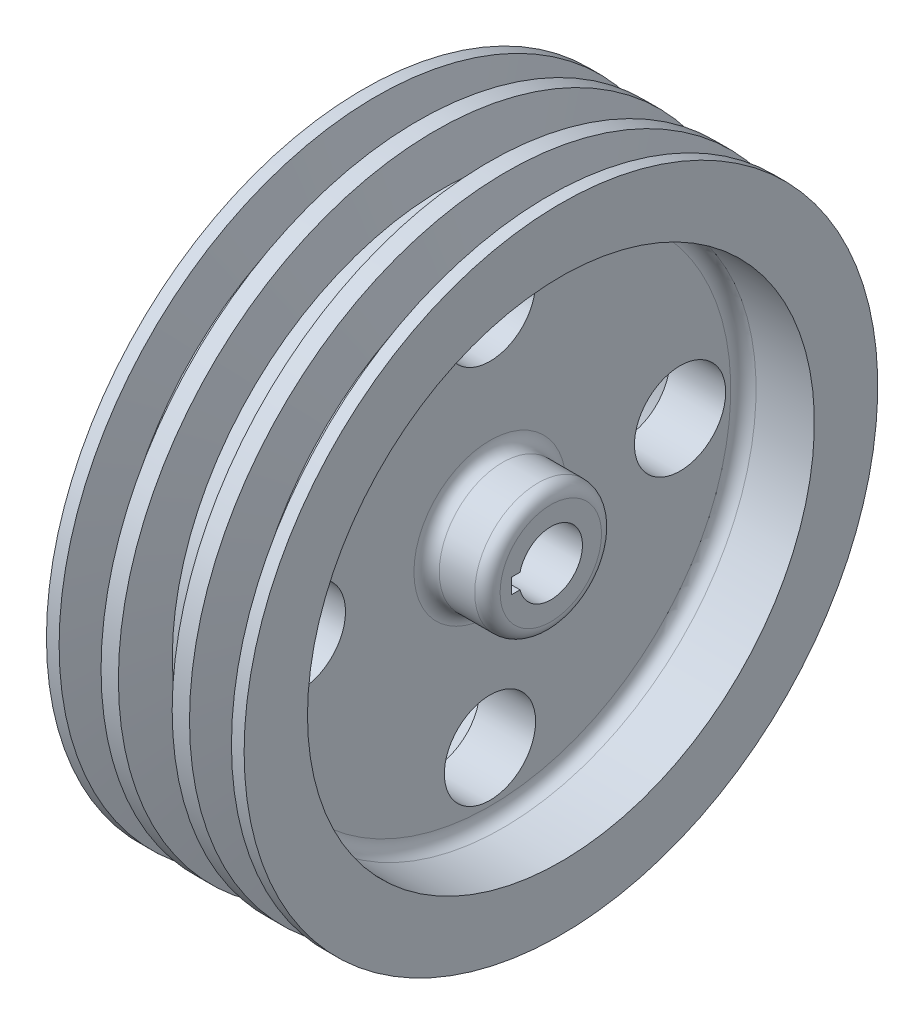
ISO-10303-21;
HEADER;
FILE_DESCRIPTION(('STEP AP214'),'2;1');
FILE_NAME('part.step','',(''),(''),'','','');
FILE_SCHEMA(('AUTOMOTIVE_DESIGN { 1 0 10303 214 1 1 1 1 }'));
ENDSEC;
DATA;
#1=APPLICATION_CONTEXT('core data for automotive mechanical design processes');
#2=APPLICATION_PROTOCOL_DEFINITION('international standard','automotive_design',2000,#1);
#3=PRODUCT_CONTEXT('',#1,'mechanical');
#4=PRODUCT('Part','Part','',(#3));
#5=PRODUCT_RELATED_PRODUCT_CATEGORY('part','',(#4));
#6=PRODUCT_DEFINITION_FORMATION('','',#4);
#7=PRODUCT_DEFINITION_CONTEXT('part definition',#1,'design');
#8=PRODUCT_DEFINITION('design','',#6,#7);
#9=PRODUCT_DEFINITION_SHAPE('','',#8);
#10=(LENGTH_UNIT() NAMED_UNIT(*) SI_UNIT(.MILLI.,.METRE.));
#11=(NAMED_UNIT(*) PLANE_ANGLE_UNIT() SI_UNIT($,.RADIAN.));
#12=(NAMED_UNIT(*) SI_UNIT($,.STERADIAN.) SOLID_ANGLE_UNIT());
#13=UNCERTAINTY_MEASURE_WITH_UNIT(LENGTH_MEASURE(1.E-05),#10,'distance_accuracy_value','');
#14=(GEOMETRIC_REPRESENTATION_CONTEXT(3) GLOBAL_UNCERTAINTY_ASSIGNED_CONTEXT((#13)) GLOBAL_UNIT_ASSIGNED_CONTEXT((#10,
#11,#12)) REPRESENTATION_CONTEXT('',''));
#15=CARTESIAN_POINT('',(0.,0.,0.));
#16=DIRECTION('',(0.,0.,1.));
#17=DIRECTION('',(1.,0.,0.));
#18=AXIS2_PLACEMENT_3D('',#15,#16,#17);
#19=CARTESIAN_POINT('',(-121.585294609812,0.,0.));
#20=DIRECTION('',(-1.,0.,0.));
#21=DIRECTION('',(0.,0.,1.));
#22=AXIS2_PLACEMENT_3D('',#19,#20,#21);
#23=CYLINDRICAL_SURFACE('',#22,25.);
#24=CARTESIAN_POINT('',(-30.,0.,0.));
#25=DIRECTION('',(-1.,0.,0.));
#26=DIRECTION('',(0.,0.,1.));
#27=AXIS2_PLACEMENT_3D('',#24,#25,#26);
#28=CIRCLE('',#27,25.);
#29=CARTESIAN_POINT('',(-30.,0.,25.));
#30=VERTEX_POINT('',#29);
#31=EDGE_CURVE('E195',#30,#30,#28,.T.);
#32=ORIENTED_EDGE('',*,*,#31,.F.);
#33=EDGE_LOOP('',(#32));
#34=FACE_BOUND('',#33,.T.);
#35=CARTESIAN_POINT('',(-16.,0.,0.));
#36=DIRECTION('',(-1.,0.,0.));
#37=DIRECTION('',(0.,0.,1.));
#38=AXIS2_PLACEMENT_3D('',#35,#36,#37);
#39=CIRCLE('',#38,25.);
#40=CARTESIAN_POINT('',(-16.,0.,25.));
#41=VERTEX_POINT('',#40);
#42=EDGE_CURVE('E102',#41,#41,#39,.T.);
#43=ORIENTED_EDGE('',*,*,#42,.T.);
#44=EDGE_LOOP('',(#43));
#45=FACE_BOUND('',#44,.T.);
#46=ADVANCED_FACE('F43',(#34,#45),#23,.T.);
#47=CARTESIAN_POINT('',(-30.,0.,0.));
#48=DIRECTION('',(-1.,0.,0.));
#49=DIRECTION('',(0.,0.,1.));
#50=AXIS2_PLACEMENT_3D('',#47,#48,#49);
#51=TOROIDAL_SURFACE('',#50,20.,5.);
#52=CARTESIAN_POINT('',(-35.,0.,0.));
#53=DIRECTION('',(-1.,0.,0.));
#54=DIRECTION('',(0.,0.,1.));
#55=AXIS2_PLACEMENT_3D('',#52,#53,#54);
#56=CIRCLE('',#55,20.);
#57=CARTESIAN_POINT('',(-35.,0.,20.));
#58=VERTEX_POINT('',#57);
#59=EDGE_CURVE('E188',#58,#58,#56,.T.);
#60=ORIENTED_EDGE('',*,*,#59,.F.);
#61=EDGE_LOOP('',(#60));
#62=FACE_BOUND('',#61,.T.);
#63=ORIENTED_EDGE('',*,*,#31,.T.);
#64=EDGE_LOOP('',(#63));
#65=FACE_BOUND('',#64,.T.);
#66=ADVANCED_FACE('F325',(#62,#65),#51,.T.);
#67=CARTESIAN_POINT('',(-35.,0.,0.));
#68=DIRECTION('',(1.,0.,0.));
#69=DIRECTION('',(0.,0.,-1.));
#70=AXIS2_PLACEMENT_3D('',#67,#68,#69);
#71=PLANE('',#70);
#72=DIRECTION('',(0.,-1.,0.));
#73=VECTOR('',#72,1.);
#74=CARTESIAN_POINT('',(-35.,0.,15.5));
#75=LINE('',#74,#73);
#76=CARTESIAN_POINT('',(-35.,3.,15.5));
#77=VERTEX_POINT('',#76);
#78=CARTESIAN_POINT('',(-35.,-3.,15.5));
#79=VERTEX_POINT('',#78);
#80=EDGE_CURVE('E83',#77,#79,#75,.T.);
#81=ORIENTED_EDGE('',*,*,#80,.T.);
#82=DIRECTION('',(0.,0.,-1.));
#83=VECTOR('',#82,1.);
#84=CARTESIAN_POINT('',(-35.,-3.,0.));
#85=LINE('',#84,#83);
#86=CARTESIAN_POINT('',(-35.,-3.,12.1346610995116));
#87=VERTEX_POINT('',#86);
#88=EDGE_CURVE('E105',#79,#87,#85,.T.);
#89=ORIENTED_EDGE('',*,*,#88,.T.);
#90=CARTESIAN_POINT('',(-35.,0.,0.));
#91=DIRECTION('',(-1.,0.,0.));
#92=DIRECTION('',(0.,0.,1.));
#93=AXIS2_PLACEMENT_3D('',#90,#91,#92);
#94=CIRCLE('',#93,12.5);
#95=CARTESIAN_POINT('',(-35.,3.,12.1346610995116));
#96=VERTEX_POINT('',#95);
#97=EDGE_CURVE('E101',#96,#87,#94,.T.);
#98=ORIENTED_EDGE('',*,*,#97,.F.);
#99=DIRECTION('',(0.,0.,1.));
#100=VECTOR('',#99,1.);
#101=CARTESIAN_POINT('',(-35.,3.,0.));
#102=LINE('',#101,#100);
#103=EDGE_CURVE('E87',#96,#77,#102,.T.);
#104=ORIENTED_EDGE('',*,*,#103,.T.);
#105=EDGE_LOOP('',(#81,#89,#98,#104));
#106=FACE_BOUND('',#105,.T.);
#107=ORIENTED_EDGE('',*,*,#59,.T.);
#108=EDGE_LOOP('',(#107));
#109=FACE_BOUND('',#108,.T.);
#110=ADVANCED_FACE('F98',(#106,#109),#71,.F.);
#111=CARTESIAN_POINT('',(-121.585294609812,0.,0.));
#112=DIRECTION('',(-1.,0.,0.));
#113=DIRECTION('',(0.,0.,1.));
#114=AXIS2_PLACEMENT_3D('',#111,#112,#113);
#115=CYLINDRICAL_SURFACE('',#114,12.5);
#116=DIRECTION('',(-1.,0.,0.));
#117=VECTOR('',#116,1.);
#118=CARTESIAN_POINT('',(39.,-3.,12.1346610995116));
#119=LINE('',#118,#117);
#120=CARTESIAN_POINT('',(35.,-3.,12.1346610995116));
#121=VERTEX_POINT('',#120);
#122=EDGE_CURVE('E63',#121,#87,#119,.T.);
#123=ORIENTED_EDGE('',*,*,#122,.F.);
#124=CARTESIAN_POINT('',(35.,0.,0.));
#125=DIRECTION('',(-1.,0.,0.));
#126=DIRECTION('',(0.,0.,1.));
#127=AXIS2_PLACEMENT_3D('',#124,#125,#126);
#128=CIRCLE('',#127,12.5);
#129=CARTESIAN_POINT('',(35.,3.,12.1346610995116));
#130=VERTEX_POINT('',#129);
#131=EDGE_CURVE('E183',#130,#121,#128,.T.);
#132=ORIENTED_EDGE('',*,*,#131,.F.);
#133=DIRECTION('',(-1.,0.,0.));
#134=VECTOR('',#133,1.);
#135=CARTESIAN_POINT('',(39.,3.,12.1346610995116));
#136=LINE('',#135,#134);
#137=EDGE_CURVE('E92',#130,#96,#136,.T.);
#138=ORIENTED_EDGE('',*,*,#137,.T.);
#139=ORIENTED_EDGE('',*,*,#97,.T.);
#140=EDGE_LOOP('',(#123,#132,#138,#139));
#141=FACE_BOUND('',#140,.T.);
#142=ADVANCED_FACE('F218',(#141),#115,.F.);
#143=CARTESIAN_POINT('',(35.,0.,0.));
#144=DIRECTION('',(1.,0.,0.));
#145=DIRECTION('',(0.,0.,-1.));
#146=AXIS2_PLACEMENT_3D('',#143,#144,#145);
#147=PLANE('',#146);
#148=DIRECTION('',(0.,0.,-1.));
#149=VECTOR('',#148,1.);
#150=CARTESIAN_POINT('',(35.,-3.,0.));
#151=LINE('',#150,#149);
#152=CARTESIAN_POINT('',(35.,-3.,15.5));
#153=VERTEX_POINT('',#152);
#154=EDGE_CURVE('E12',#153,#121,#151,.T.);
#155=ORIENTED_EDGE('',*,*,#154,.F.);
#156=DIRECTION('',(0.,-1.,0.));
#157=VECTOR('',#156,1.);
#158=CARTESIAN_POINT('',(35.,0.,15.5));
#159=LINE('',#158,#157);
#160=CARTESIAN_POINT('',(35.,3.,15.5));
#161=VERTEX_POINT('',#160);
#162=EDGE_CURVE('E194',#161,#153,#159,.T.);
#163=ORIENTED_EDGE('',*,*,#162,.F.);
#164=DIRECTION('',(0.,0.,1.));
#165=VECTOR('',#164,1.);
#166=CARTESIAN_POINT('',(35.,3.,0.));
#167=LINE('',#166,#165);
#168=EDGE_CURVE('E49',#130,#161,#167,.T.);
#169=ORIENTED_EDGE('',*,*,#168,.F.);
#170=ORIENTED_EDGE('',*,*,#131,.T.);
#171=EDGE_LOOP('',(#155,#163,#169,#170));
#172=FACE_BOUND('',#171,.T.);
#173=CARTESIAN_POINT('',(35.,0.,0.));
#174=DIRECTION('',(-1.,0.,0.));
#175=DIRECTION('',(0.,0.,1.));
#176=AXIS2_PLACEMENT_3D('',#173,#174,#175);
#177=CIRCLE('',#176,20.);
#178=CARTESIAN_POINT('',(35.,0.,20.));
#179=VERTEX_POINT('',#178);
#180=EDGE_CURVE('E185',#179,#179,#177,.T.);
#181=ORIENTED_EDGE('',*,*,#180,.F.);
#182=EDGE_LOOP('',(#181));
#183=FACE_BOUND('',#182,.T.);
#184=ADVANCED_FACE('F214',(#172,#183),#147,.T.);
#185=CARTESIAN_POINT('',(30.,0.,0.));
#186=DIRECTION('',(-1.,0.,0.));
#187=DIRECTION('',(0.,0.,1.));
#188=AXIS2_PLACEMENT_3D('',#185,#186,#187);
#189=TOROIDAL_SURFACE('',#188,20.,5.);
#190=CARTESIAN_POINT('',(30.,0.,0.));
#191=DIRECTION('',(-1.,0.,0.));
#192=DIRECTION('',(0.,0.,1.));
#193=AXIS2_PLACEMENT_3D('',#190,#191,#192);
#194=CIRCLE('',#193,25.);
#195=CARTESIAN_POINT('',(30.,0.,25.));
#196=VERTEX_POINT('',#195);
#197=EDGE_CURVE('E177',#196,#196,#194,.T.);
#198=ORIENTED_EDGE('',*,*,#197,.F.);
#199=EDGE_LOOP('',(#198));
#200=FACE_BOUND('',#199,.T.);
#201=ORIENTED_EDGE('',*,*,#180,.T.);
#202=EDGE_LOOP('',(#201));
#203=FACE_BOUND('',#202,.T.);
#204=ADVANCED_FACE('F520',(#200,#203),#189,.T.);
#205=CARTESIAN_POINT('',(-121.585294609812,0.,0.));
#206=DIRECTION('',(-1.,0.,0.));
#207=DIRECTION('',(0.,0.,1.));
#208=AXIS2_PLACEMENT_3D('',#205,#206,#207);
#209=CYLINDRICAL_SURFACE('',#208,25.);
#210=ORIENTED_EDGE('',*,*,#197,.T.);
#211=EDGE_LOOP('',(#210));
#212=FACE_BOUND('',#211,.T.);
#213=CARTESIAN_POINT('',(16.,0.,0.));
#214=DIRECTION('',(-1.,0.,0.));
#215=DIRECTION('',(0.,0.,1.));
#216=AXIS2_PLACEMENT_3D('',#213,#214,#215);
#217=CIRCLE('',#216,25.);
#218=CARTESIAN_POINT('',(16.,0.,25.));
#219=VERTEX_POINT('',#218);
#220=EDGE_CURVE('E178',#219,#219,#217,.T.);
#221=ORIENTED_EDGE('',*,*,#220,.F.);
#222=EDGE_LOOP('',(#221));
#223=FACE_BOUND('',#222,.T.);
#224=ADVANCED_FACE('F618',(#212,#223),#209,.T.);
#225=CARTESIAN_POINT('',(16.,0.,0.));
#226=DIRECTION('',(-1.,0.,0.));
#227=DIRECTION('',(0.,0.,1.));
#228=AXIS2_PLACEMENT_3D('',#225,#226,#227);
#229=TOROIDAL_SURFACE('',#228,30.,5.);
#230=CARTESIAN_POINT('',(11.,0.,0.));
#231=DIRECTION('',(-1.,0.,0.));
#232=DIRECTION('',(0.,0.,1.));
#233=AXIS2_PLACEMENT_3D('',#230,#231,#232);
#234=CIRCLE('',#233,30.);
#235=CARTESIAN_POINT('',(11.,0.,30.));
#236=VERTEX_POINT('',#235);
#237=EDGE_CURVE('E172',#236,#236,#234,.T.);
#238=ORIENTED_EDGE('',*,*,#237,.F.);
#239=EDGE_LOOP('',(#238));
#240=FACE_BOUND('',#239,.T.);
#241=ORIENTED_EDGE('',*,*,#220,.T.);
#242=EDGE_LOOP('',(#241));
#243=FACE_BOUND('',#242,.T.);
#244=ADVANCED_FACE('F236',(#240,#243),#229,.F.);
#245=CARTESIAN_POINT('',(11.,0.,0.));
#246=DIRECTION('',(1.,0.,0.));
#247=DIRECTION('',(0.,0.,-1.));
#248=AXIS2_PLACEMENT_3D('',#245,#246,#247);
#249=PLANE('',#248);
#250=CARTESIAN_POINT('',(11.,75.,0.));
#251=DIRECTION('',(1.,0.,0.));
#252=DIRECTION('',(0.,0.,-1.));
#253=AXIS2_PLACEMENT_3D('',#250,#251,#252);
#254=CIRCLE('',#253,18.);
#255=CARTESIAN_POINT('',(11.,75.,-18.));
#256=VERTEX_POINT('',#255);
#257=EDGE_CURVE('E86',#256,#256,#254,.T.);
#258=ORIENTED_EDGE('',*,*,#257,.F.);
#259=EDGE_LOOP('',(#258));
#260=FACE_BOUND('',#259,.T.);
#261=CARTESIAN_POINT('',(11.,7.85583301239705E-13,-75.));
#262=DIRECTION('',(1.,0.,0.));
#263=DIRECTION('',(0.,0.,-1.));
#264=AXIS2_PLACEMENT_3D('',#261,#262,#263);
#265=CIRCLE('',#264,18.);
#266=CARTESIAN_POINT('',(11.,7.85583301239705E-13,-93.));
#267=VERTEX_POINT('',#266);
#268=EDGE_CURVE('E210',#267,#267,#265,.T.);
#269=ORIENTED_EDGE('',*,*,#268,.F.);
#270=EDGE_LOOP('',(#269));
#271=FACE_BOUND('',#270,.T.);
#272=CARTESIAN_POINT('',(11.,-75.,-5.2372220082647E-13));
#273=DIRECTION('',(1.,0.,0.));
#274=DIRECTION('',(0.,0.,-1.));
#275=AXIS2_PLACEMENT_3D('',#272,#273,#274);
#276=CIRCLE('',#275,18.);
#277=CARTESIAN_POINT('',(11.,-75.,-18.0000000000005));
#278=VERTEX_POINT('',#277);
#279=EDGE_CURVE('E201',#278,#278,#276,.T.);
#280=ORIENTED_EDGE('',*,*,#279,.F.);
#281=EDGE_LOOP('',(#280));
#282=FACE_BOUND('',#281,.T.);
#283=CARTESIAN_POINT('',(11.,-2.61861100413235E-13,75.));
#284=DIRECTION('',(1.,0.,0.));
#285=DIRECTION('',(0.,0.,-1.));
#286=AXIS2_PLACEMENT_3D('',#283,#284,#285);
#287=CIRCLE('',#286,18.);
#288=CARTESIAN_POINT('',(11.,-2.61861100413235E-13,57.));
#289=VERTEX_POINT('',#288);
#290=EDGE_CURVE('E200',#289,#289,#287,.T.);
#291=ORIENTED_EDGE('',*,*,#290,.F.);
#292=EDGE_LOOP('',(#291));
#293=FACE_BOUND('',#292,.T.);
#294=ORIENTED_EDGE('',*,*,#237,.T.);
#295=EDGE_LOOP('',(#294));
#296=FACE_BOUND('',#295,.T.);
#297=CARTESIAN_POINT('',(11.,0.,0.));
#298=DIRECTION('',(-1.,0.,0.));
#299=DIRECTION('',(0.,0.,1.));
#300=AXIS2_PLACEMENT_3D('',#297,#298,#299);
#301=CIRCLE('',#300,95.);
#302=CARTESIAN_POINT('',(11.,0.,95.));
#303=VERTEX_POINT('',#302);
#304=EDGE_CURVE('E168',#303,#303,#301,.T.);
#305=ORIENTED_EDGE('',*,*,#304,.F.);
#306=EDGE_LOOP('',(#305));
#307=FACE_BOUND('',#306,.T.);
#308=ADVANCED_FACE('F232',(#260,#271,#282,#293,#296,#307),#249,.T.);
#309=CARTESIAN_POINT('',(16.,0.,0.));
#310=DIRECTION('',(-1.,0.,0.));
#311=DIRECTION('',(0.,0.,1.));
#312=AXIS2_PLACEMENT_3D('',#309,#310,#311);
#313=TOROIDAL_SURFACE('',#312,95.,5.);
#314=ORIENTED_EDGE('',*,*,#304,.T.);
#315=EDGE_LOOP('',(#314));
#316=FACE_BOUND('',#315,.T.);
#317=CARTESIAN_POINT('',(16.,0.,0.));
#318=DIRECTION('',(-1.,0.,0.));
#319=DIRECTION('',(0.,0.,1.));
#320=AXIS2_PLACEMENT_3D('',#317,#318,#319);
#321=CIRCLE('',#320,100.);
#322=CARTESIAN_POINT('',(16.,0.,100.));
#323=VERTEX_POINT('',#322);
#324=EDGE_CURVE('E170',#323,#323,#321,.T.);
#325=ORIENTED_EDGE('',*,*,#324,.F.);
#326=EDGE_LOOP('',(#325));
#327=FACE_BOUND('',#326,.T.);
#328=ADVANCED_FACE('F240',(#316,#327),#313,.F.);
#329=CARTESIAN_POINT('',(-121.585294609812,0.,0.));
#330=DIRECTION('',(-1.,0.,0.));
#331=DIRECTION('',(0.,0.,1.));
#332=AXIS2_PLACEMENT_3D('',#329,#330,#331);
#333=CYLINDRICAL_SURFACE('',#332,100.);
#334=ORIENTED_EDGE('',*,*,#324,.T.);
#335=EDGE_LOOP('',(#334));
#336=FACE_BOUND('',#335,.T.);
#337=CARTESIAN_POINT('',(39.,0.,0.));
#338=DIRECTION('',(-1.,0.,0.));
#339=DIRECTION('',(0.,0.,1.));
#340=AXIS2_PLACEMENT_3D('',#337,#338,#339);
#341=CIRCLE('',#340,100.);
#342=CARTESIAN_POINT('',(39.,0.,100.));
#343=VERTEX_POINT('',#342);
#344=EDGE_CURVE('E163',#343,#343,#341,.T.);
#345=ORIENTED_EDGE('',*,*,#344,.F.);
#346=EDGE_LOOP('',(#345));
#347=FACE_BOUND('',#346,.T.);
#348=ADVANCED_FACE('F252',(#336,#347),#333,.F.);
#349=CARTESIAN_POINT('',(39.,0.,0.));
#350=DIRECTION('',(1.,0.,0.));
#351=DIRECTION('',(0.,0.,-1.));
#352=AXIS2_PLACEMENT_3D('',#349,#350,#351);
#353=PLANE('',#352);
#354=ORIENTED_EDGE('',*,*,#344,.T.);
#355=EDGE_LOOP('',(#354));
#356=FACE_BOUND('',#355,.T.);
#357=CARTESIAN_POINT('',(39.,0.,0.));
#358=DIRECTION('',(-1.,0.,0.));
#359=DIRECTION('',(0.,0.,1.));
#360=AXIS2_PLACEMENT_3D('',#357,#358,#359);
#361=CIRCLE('',#360,125.);
#362=CARTESIAN_POINT('',(39.,0.,125.));
#363=VERTEX_POINT('',#362);
#364=EDGE_CURVE('E161',#363,#363,#361,.T.);
#365=ORIENTED_EDGE('',*,*,#364,.F.);
#366=EDGE_LOOP('',(#365));
#367=FACE_BOUND('',#366,.T.);
#368=ADVANCED_FACE('F256',(#356,#367),#353,.T.);
#369=CARTESIAN_POINT('',(-121.585294609812,0.,0.));
#370=DIRECTION('',(-1.,0.,0.));
#371=DIRECTION('',(0.,0.,1.));
#372=AXIS2_PLACEMENT_3D('',#369,#370,#371);
#373=CYLINDRICAL_SURFACE('',#372,125.);
#374=ORIENTED_EDGE('',*,*,#364,.T.);
#375=EDGE_LOOP('',(#374));
#376=FACE_BOUND('',#375,.T.);
#377=CARTESIAN_POINT('',(34.,0.,0.));
#378=DIRECTION('',(-1.,0.,0.));
#379=DIRECTION('',(0.,0.,1.));
#380=AXIS2_PLACEMENT_3D('',#377,#378,#379);
#381=CIRCLE('',#380,125.);
#382=CARTESIAN_POINT('',(34.,0.,125.));
#383=VERTEX_POINT('',#382);
#384=EDGE_CURVE('E158',#383,#383,#381,.T.);
#385=ORIENTED_EDGE('',*,*,#384,.F.);
#386=EDGE_LOOP('',(#385));
#387=FACE_BOUND('',#386,.T.);
#388=ADVANCED_FACE('F262',(#376,#387),#373,.T.);
#389=CARTESIAN_POINT('',(30.7242678916041,0.,0.));
#390=DIRECTION('',(1.,0.,0.));
#391=DIRECTION('',(0.,0.,-1.));
#392=AXIS2_PLACEMENT_3D('',#389,#390,#391);
#393=CONICAL_SURFACE('',#392,107.,1.39078123836655);
#394=ORIENTED_EDGE('',*,*,#384,.T.);
#395=EDGE_LOOP('',(#394));
#396=FACE_BOUND('',#395,.T.);
#397=CARTESIAN_POINT('',(30.7242678916041,0.,0.));
#398=DIRECTION('',(-1.,0.,0.));
#399=DIRECTION('',(0.,0.,1.));
#400=AXIS2_PLACEMENT_3D('',#397,#398,#399);
#401=CIRCLE('',#400,107.);
#402=CARTESIAN_POINT('',(30.7242678916041,0.,107.));
#403=VERTEX_POINT('',#402);
#404=EDGE_CURVE('E154',#403,#403,#401,.T.);
#405=ORIENTED_EDGE('',*,*,#404,.F.);
#406=EDGE_LOOP('',(#405));
#407=FACE_BOUND('',#406,.T.);
#408=ADVANCED_FACE('F269',(#396,#407),#393,.T.);
#409=CARTESIAN_POINT('',(-121.585294609812,0.,0.));
#410=DIRECTION('',(-1.,0.,0.));
#411=DIRECTION('',(0.,0.,1.));
#412=AXIS2_PLACEMENT_3D('',#409,#410,#411);
#413=CYLINDRICAL_SURFACE('',#412,107.);
#414=ORIENTED_EDGE('',*,*,#404,.T.);
#415=EDGE_LOOP('',(#414));
#416=FACE_BOUND('',#415,.T.);
#417=CARTESIAN_POINT('',(20.7242678916041,0.,0.));
#418=DIRECTION('',(-1.,0.,0.));
#419=DIRECTION('',(0.,0.,1.));
#420=AXIS2_PLACEMENT_3D('',#417,#418,#419);
#421=CIRCLE('',#420,107.);
#422=CARTESIAN_POINT('',(20.7242678916041,0.,107.));
#423=VERTEX_POINT('',#422);
#424=EDGE_CURVE('E155',#423,#423,#421,.T.);
#425=ORIENTED_EDGE('',*,*,#424,.F.);
#426=EDGE_LOOP('',(#425));
#427=FACE_BOUND('',#426,.T.);
#428=ADVANCED_FACE('F277',(#416,#427),#413,.T.);
#429=CARTESIAN_POINT('',(17.4485357832083,0.,0.));
#430=DIRECTION('',(-1.,0.,0.));
#431=DIRECTION('',(0.,0.,1.));
#432=AXIS2_PLACEMENT_3D('',#429,#430,#431);
#433=CONICAL_SURFACE('',#432,125.,1.39078123836656);
#434=ORIENTED_EDGE('',*,*,#424,.T.);
#435=EDGE_LOOP('',(#434));
#436=FACE_BOUND('',#435,.T.);
#437=CARTESIAN_POINT('',(17.4485357832083,0.,0.));
#438=DIRECTION('',(-1.,0.,0.));
#439=DIRECTION('',(0.,0.,1.));
#440=AXIS2_PLACEMENT_3D('',#437,#438,#439);
#441=CIRCLE('',#440,125.);
#442=CARTESIAN_POINT('',(17.4485357832083,0.,125.));
#443=VERTEX_POINT('',#442);
#444=EDGE_CURVE('E149',#443,#443,#441,.T.);
#445=ORIENTED_EDGE('',*,*,#444,.F.);
#446=EDGE_LOOP('',(#445));
#447=FACE_BOUND('',#446,.T.);
#448=ADVANCED_FACE('F285',(#436,#447),#433,.T.);
#449=CARTESIAN_POINT('',(-121.585294609812,0.,0.));
#450=DIRECTION('',(-1.,0.,0.));
#451=DIRECTION('',(0.,0.,1.));
#452=AXIS2_PLACEMENT_3D('',#449,#450,#451);
#453=CYLINDRICAL_SURFACE('',#452,125.);
#454=ORIENTED_EDGE('',*,*,#444,.T.);
#455=EDGE_LOOP('',(#454));
#456=FACE_BOUND('',#455,.T.);
#457=CARTESIAN_POINT('',(10.6113648581892,0.,0.));
#458=DIRECTION('',(-1.,0.,0.));
#459=DIRECTION('',(0.,0.,1.));
#460=AXIS2_PLACEMENT_3D('',#457,#458,#459);
#461=CIRCLE('',#460,125.);
#462=CARTESIAN_POINT('',(10.6113648581892,0.,125.));
#463=VERTEX_POINT('',#462);
#464=EDGE_CURVE('E148',#463,#463,#461,.T.);
#465=ORIENTED_EDGE('',*,*,#464,.F.);
#466=EDGE_LOOP('',(#465));
#467=FACE_BOUND('',#466,.T.);
#468=ADVANCED_FACE('F286',(#456,#467),#453,.T.);
#469=CARTESIAN_POINT('',(7.33563274979332,0.,0.));
#470=DIRECTION('',(1.,0.,0.));
#471=DIRECTION('',(0.,0.,-1.));
#472=AXIS2_PLACEMENT_3D('',#469,#470,#471);
#473=CONICAL_SURFACE('',#472,107.,1.39078123836655);
#474=ORIENTED_EDGE('',*,*,#464,.T.);
#475=EDGE_LOOP('',(#474));
#476=FACE_BOUND('',#475,.T.);
#477=CARTESIAN_POINT('',(7.33563274979332,0.,0.));
#478=DIRECTION('',(-1.,0.,0.));
#479=DIRECTION('',(0.,0.,1.));
#480=AXIS2_PLACEMENT_3D('',#477,#478,#479);
#481=CIRCLE('',#480,107.);
#482=CARTESIAN_POINT('',(7.33563274979332,0.,107.));
#483=VERTEX_POINT('',#482);
#484=EDGE_CURVE('E141',#483,#483,#481,.T.);
#485=ORIENTED_EDGE('',*,*,#484,.F.);
#486=EDGE_LOOP('',(#485));
#487=FACE_BOUND('',#486,.T.);
#488=ADVANCED_FACE('F294',(#476,#487),#473,.T.);
#489=CARTESIAN_POINT('',(-121.585294609812,0.,0.));
#490=DIRECTION('',(-1.,0.,0.));
#491=DIRECTION('',(0.,0.,1.));
#492=AXIS2_PLACEMENT_3D('',#489,#490,#491);
#493=CYLINDRICAL_SURFACE('',#492,107.);
#494=ORIENTED_EDGE('',*,*,#484,.T.);
#495=EDGE_LOOP('',(#494));
#496=FACE_BOUND('',#495,.T.);
#497=CARTESIAN_POINT('',(-7.33563274979339,0.,0.));
#498=DIRECTION('',(-1.,0.,0.));
#499=DIRECTION('',(0.,0.,1.));
#500=AXIS2_PLACEMENT_3D('',#497,#498,#499);
#501=CIRCLE('',#500,107.);
#502=CARTESIAN_POINT('',(-7.33563274979339,0.,107.));
#503=VERTEX_POINT('',#502);
#504=EDGE_CURVE('E139',#503,#503,#501,.T.);
#505=ORIENTED_EDGE('',*,*,#504,.F.);
#506=EDGE_LOOP('',(#505));
#507=FACE_BOUND('',#506,.T.);
#508=ADVANCED_FACE('F299',(#496,#507),#493,.T.);
#509=CARTESIAN_POINT('',(-7.33563274979339,0.,0.));
#510=DIRECTION('',(-1.,0.,0.));
#511=DIRECTION('',(0.,0.,1.));
#512=AXIS2_PLACEMENT_3D('',#509,#510,#511);
#513=CONICAL_SURFACE('',#512,107.,1.39078123836656);
#514=CARTESIAN_POINT('',(-10.6113648581892,0.,0.));
#515=DIRECTION('',(-1.,0.,0.));
#516=DIRECTION('',(0.,0.,1.));
#517=AXIS2_PLACEMENT_3D('',#514,#515,#516);
#518=CIRCLE('',#517,125.);
#519=CARTESIAN_POINT('',(-10.6113648581892,0.,125.));
#520=VERTEX_POINT('',#519);
#521=EDGE_CURVE('E140',#520,#520,#518,.T.);
#522=ORIENTED_EDGE('',*,*,#521,.F.);
#523=EDGE_LOOP('',(#522));
#524=FACE_BOUND('',#523,.T.);
#525=ORIENTED_EDGE('',*,*,#504,.T.);
#526=EDGE_LOOP('',(#525));
#527=FACE_BOUND('',#526,.T.);
#528=ADVANCED_FACE('F308',(#524,#527),#513,.T.);
#529=CARTESIAN_POINT('',(-121.585294609812,0.,0.));
#530=DIRECTION('',(-1.,0.,0.));
#531=DIRECTION('',(0.,0.,1.));
#532=AXIS2_PLACEMENT_3D('',#529,#530,#531);
#533=CYLINDRICAL_SURFACE('',#532,125.);
#534=CARTESIAN_POINT('',(-17.4485357832083,0.,0.));
#535=DIRECTION('',(-1.,0.,0.));
#536=DIRECTION('',(0.,0.,1.));
#537=AXIS2_PLACEMENT_3D('',#534,#535,#536);
#538=CIRCLE('',#537,125.);
#539=CARTESIAN_POINT('',(-17.4485357832083,0.,125.));
#540=VERTEX_POINT('',#539);
#541=EDGE_CURVE('E133',#540,#540,#538,.T.);
#542=ORIENTED_EDGE('',*,*,#541,.F.);
#543=EDGE_LOOP('',(#542));
#544=FACE_BOUND('',#543,.T.);
#545=ORIENTED_EDGE('',*,*,#521,.T.);
#546=EDGE_LOOP('',(#545));
#547=FACE_BOUND('',#546,.T.);
#548=ADVANCED_FACE('F313',(#544,#547),#533,.T.);
#549=CARTESIAN_POINT('',(-17.4485357832083,0.,0.));
#550=DIRECTION('',(1.,0.,0.));
#551=DIRECTION('',(0.,0.,-1.));
#552=AXIS2_PLACEMENT_3D('',#549,#550,#551);
#553=CONICAL_SURFACE('',#552,125.,1.39078123836656);
#554=CARTESIAN_POINT('',(-20.7242678916041,0.,0.));
#555=DIRECTION('',(-1.,0.,0.));
#556=DIRECTION('',(0.,0.,1.));
#557=AXIS2_PLACEMENT_3D('',#554,#555,#556);
#558=CIRCLE('',#557,107.);
#559=CARTESIAN_POINT('',(-20.7242678916041,0.,107.));
#560=VERTEX_POINT('',#559);
#561=EDGE_CURVE('E131',#560,#560,#558,.T.);
#562=ORIENTED_EDGE('',*,*,#561,.F.);
#563=EDGE_LOOP('',(#562));
#564=FACE_BOUND('',#563,.T.);
#565=ORIENTED_EDGE('',*,*,#541,.T.);
#566=EDGE_LOOP('',(#565));
#567=FACE_BOUND('',#566,.T.);
#568=ADVANCED_FACE('F320',(#564,#567),#553,.T.);
#569=CARTESIAN_POINT('',(-121.585294609812,0.,0.));
#570=DIRECTION('',(-1.,0.,0.));
#571=DIRECTION('',(0.,0.,1.));
#572=AXIS2_PLACEMENT_3D('',#569,#570,#571);
#573=CYLINDRICAL_SURFACE('',#572,107.);
#574=CARTESIAN_POINT('',(-30.7242678916041,0.,0.));
#575=DIRECTION('',(-1.,0.,0.));
#576=DIRECTION('',(0.,0.,1.));
#577=AXIS2_PLACEMENT_3D('',#574,#575,#576);
#578=CIRCLE('',#577,107.);
#579=CARTESIAN_POINT('',(-30.7242678916041,0.,107.));
#580=VERTEX_POINT('',#579);
#581=EDGE_CURVE('E126',#580,#580,#578,.T.);
#582=ORIENTED_EDGE('',*,*,#581,.F.);
#583=EDGE_LOOP('',(#582));
#584=FACE_BOUND('',#583,.T.);
#585=ORIENTED_EDGE('',*,*,#561,.T.);
#586=EDGE_LOOP('',(#585));
#587=FACE_BOUND('',#586,.T.);
#588=ADVANCED_FACE('F366',(#584,#587),#573,.T.);
#589=CARTESIAN_POINT('',(-30.7242678916041,0.,0.));
#590=DIRECTION('',(-1.,0.,0.));
#591=DIRECTION('',(0.,0.,1.));
#592=AXIS2_PLACEMENT_3D('',#589,#590,#591);
#593=CONICAL_SURFACE('',#592,107.,1.39078123836655);
#594=CARTESIAN_POINT('',(-34.,0.,0.));
#595=DIRECTION('',(-1.,0.,0.));
#596=DIRECTION('',(0.,0.,1.));
#597=AXIS2_PLACEMENT_3D('',#594,#595,#596);
#598=CIRCLE('',#597,125.);
#599=CARTESIAN_POINT('',(-34.,0.,125.));
#600=VERTEX_POINT('',#599);
#601=EDGE_CURVE('E124',#600,#600,#598,.T.);
#602=ORIENTED_EDGE('',*,*,#601,.F.);
#603=EDGE_LOOP('',(#602));
#604=FACE_BOUND('',#603,.T.);
#605=ORIENTED_EDGE('',*,*,#581,.T.);
#606=EDGE_LOOP('',(#605));
#607=FACE_BOUND('',#606,.T.);
#608=ADVANCED_FACE('F365',(#604,#607),#593,.T.);
#609=CARTESIAN_POINT('',(-121.585294609812,0.,0.));
#610=DIRECTION('',(-1.,0.,0.));
#611=DIRECTION('',(0.,0.,1.));
#612=AXIS2_PLACEMENT_3D('',#609,#610,#611);
#613=CYLINDRICAL_SURFACE('',#612,125.);
#614=CARTESIAN_POINT('',(-39.,0.,0.));
#615=DIRECTION('',(-1.,0.,0.));
#616=DIRECTION('',(0.,0.,1.));
#617=AXIS2_PLACEMENT_3D('',#614,#615,#616);
#618=CIRCLE('',#617,125.);
#619=CARTESIAN_POINT('',(-39.,0.,125.));
#620=VERTEX_POINT('',#619);
#621=EDGE_CURVE('E125',#620,#620,#618,.T.);
#622=ORIENTED_EDGE('',*,*,#621,.F.);
#623=EDGE_LOOP('',(#622));
#624=FACE_BOUND('',#623,.T.);
#625=ORIENTED_EDGE('',*,*,#601,.T.);
#626=EDGE_LOOP('',(#625));
#627=FACE_BOUND('',#626,.T.);
#628=ADVANCED_FACE('F359',(#624,#627),#613,.T.);
#629=CARTESIAN_POINT('',(-39.,0.,0.));
#630=DIRECTION('',(1.,0.,0.));
#631=DIRECTION('',(0.,0.,-1.));
#632=AXIS2_PLACEMENT_3D('',#629,#630,#631);
#633=PLANE('',#632);
#634=CARTESIAN_POINT('',(-39.,0.,0.));
#635=DIRECTION('',(-1.,0.,0.));
#636=DIRECTION('',(0.,0.,1.));
#637=AXIS2_PLACEMENT_3D('',#634,#635,#636);
#638=CIRCLE('',#637,100.);
#639=CARTESIAN_POINT('',(-39.,0.,100.));
#640=VERTEX_POINT('',#639);
#641=EDGE_CURVE('E118',#640,#640,#638,.T.);
#642=ORIENTED_EDGE('',*,*,#641,.F.);
#643=EDGE_LOOP('',(#642));
#644=FACE_BOUND('',#643,.T.);
#645=ORIENTED_EDGE('',*,*,#621,.T.);
#646=EDGE_LOOP('',(#645));
#647=FACE_BOUND('',#646,.T.);
#648=ADVANCED_FACE('F353',(#644,#647),#633,.F.);
#649=CARTESIAN_POINT('',(-121.585294609812,0.,0.));
#650=DIRECTION('',(-1.,0.,0.));
#651=DIRECTION('',(0.,0.,1.));
#652=AXIS2_PLACEMENT_3D('',#649,#650,#651);
#653=CYLINDRICAL_SURFACE('',#652,100.);
#654=CARTESIAN_POINT('',(-16.,0.,0.));
#655=DIRECTION('',(-1.,0.,0.));
#656=DIRECTION('',(0.,0.,1.));
#657=AXIS2_PLACEMENT_3D('',#654,#655,#656);
#658=CIRCLE('',#657,100.);
#659=CARTESIAN_POINT('',(-16.,0.,100.));
#660=VERTEX_POINT('',#659);
#661=EDGE_CURVE('E116',#660,#660,#658,.T.);
#662=ORIENTED_EDGE('',*,*,#661,.F.);
#663=EDGE_LOOP('',(#662));
#664=FACE_BOUND('',#663,.T.);
#665=ORIENTED_EDGE('',*,*,#641,.T.);
#666=EDGE_LOOP('',(#665));
#667=FACE_BOUND('',#666,.T.);
#668=ADVANCED_FACE('F346',(#664,#667),#653,.F.);
#669=CARTESIAN_POINT('',(-16.,0.,0.));
#670=DIRECTION('',(-1.,0.,0.));
#671=DIRECTION('',(0.,0.,1.));
#672=AXIS2_PLACEMENT_3D('',#669,#670,#671);
#673=TOROIDAL_SURFACE('',#672,95.,5.);
#674=ORIENTED_EDGE('',*,*,#661,.T.);
#675=EDGE_LOOP('',(#674));
#676=FACE_BOUND('',#675,.T.);
#677=CARTESIAN_POINT('',(-11.,0.,0.));
#678=DIRECTION('',(-1.,0.,0.));
#679=DIRECTION('',(0.,0.,1.));
#680=AXIS2_PLACEMENT_3D('',#677,#678,#679);
#681=CIRCLE('',#680,95.);
#682=CARTESIAN_POINT('',(-11.,0.,95.));
#683=VERTEX_POINT('',#682);
#684=EDGE_CURVE('E114',#683,#683,#681,.T.);
#685=ORIENTED_EDGE('',*,*,#684,.F.);
#686=EDGE_LOOP('',(#685));
#687=FACE_BOUND('',#686,.T.);
#688=ADVANCED_FACE('F345',(#676,#687),#673,.F.);
#689=CARTESIAN_POINT('',(-11.,0.,0.));
#690=DIRECTION('',(1.,0.,0.));
#691=DIRECTION('',(0.,0.,-1.));
#692=AXIS2_PLACEMENT_3D('',#689,#690,#691);
#693=PLANE('',#692);
#694=CARTESIAN_POINT('',(-11.,75.,0.));
#695=DIRECTION('',(1.,0.,0.));
#696=DIRECTION('',(0.,0.,-1.));
#697=AXIS2_PLACEMENT_3D('',#694,#695,#696);
#698=CIRCLE('',#697,18.);
#699=CARTESIAN_POINT('',(-11.,75.,-18.));
#700=VERTEX_POINT('',#699);
#701=EDGE_CURVE('E208',#700,#700,#698,.T.);
#702=ORIENTED_EDGE('',*,*,#701,.T.);
#703=EDGE_LOOP('',(#702));
#704=FACE_BOUND('',#703,.T.);
#705=CARTESIAN_POINT('',(-11.,7.85583301239705E-13,-75.));
#706=DIRECTION('',(1.,0.,0.));
#707=DIRECTION('',(0.,0.,-1.));
#708=AXIS2_PLACEMENT_3D('',#705,#706,#707);
#709=CIRCLE('',#708,18.);
#710=CARTESIAN_POINT('',(-11.,7.85583301239705E-13,-93.));
#711=VERTEX_POINT('',#710);
#712=EDGE_CURVE('E204',#711,#711,#709,.T.);
#713=ORIENTED_EDGE('',*,*,#712,.T.);
#714=EDGE_LOOP('',(#713));
#715=FACE_BOUND('',#714,.T.);
#716=CARTESIAN_POINT('',(-11.,-75.,-5.2372220082647E-13));
#717=DIRECTION('',(1.,0.,0.));
#718=DIRECTION('',(0.,0.,-1.));
#719=AXIS2_PLACEMENT_3D('',#716,#717,#718);
#720=CIRCLE('',#719,18.);
#721=CARTESIAN_POINT('',(-11.,-75.,-18.0000000000005));
#722=VERTEX_POINT('',#721);
#723=EDGE_CURVE('E199',#722,#722,#720,.T.);
#724=ORIENTED_EDGE('',*,*,#723,.T.);
#725=EDGE_LOOP('',(#724));
#726=FACE_BOUND('',#725,.T.);
#727=CARTESIAN_POINT('',(-11.,-2.61861100413235E-13,75.));
#728=DIRECTION('',(1.,0.,0.));
#729=DIRECTION('',(0.,0.,-1.));
#730=AXIS2_PLACEMENT_3D('',#727,#728,#729);
#731=CIRCLE('',#730,18.);
#732=CARTESIAN_POINT('',(-11.,-2.61861100413235E-13,57.));
#733=VERTEX_POINT('',#732);
#734=EDGE_CURVE('E198',#733,#733,#731,.T.);
#735=ORIENTED_EDGE('',*,*,#734,.T.);
#736=EDGE_LOOP('',(#735));
#737=FACE_BOUND('',#736,.T.);
#738=CARTESIAN_POINT('',(-11.,0.,0.));
#739=DIRECTION('',(-1.,0.,0.));
#740=DIRECTION('',(0.,0.,1.));
#741=AXIS2_PLACEMENT_3D('',#738,#739,#740);
#742=CIRCLE('',#741,30.);
#743=CARTESIAN_POINT('',(-11.,0.,30.));
#744=VERTEX_POINT('',#743);
#745=EDGE_CURVE('E109',#744,#744,#742,.T.);
#746=ORIENTED_EDGE('',*,*,#745,.F.);
#747=EDGE_LOOP('',(#746));
#748=FACE_BOUND('',#747,.T.);
#749=ORIENTED_EDGE('',*,*,#684,.T.);
#750=EDGE_LOOP('',(#749));
#751=FACE_BOUND('',#750,.T.);
#752=ADVANCED_FACE('F336',(#704,#715,#726,#737,#748,#751),#693,.F.);
#753=CARTESIAN_POINT('',(-16.,0.,0.));
#754=DIRECTION('',(-1.,0.,0.));
#755=DIRECTION('',(0.,0.,1.));
#756=AXIS2_PLACEMENT_3D('',#753,#754,#755);
#757=TOROIDAL_SURFACE('',#756,30.,5.);
#758=ORIENTED_EDGE('',*,*,#42,.F.);
#759=EDGE_LOOP('',(#758));
#760=FACE_BOUND('',#759,.T.);
#761=ORIENTED_EDGE('',*,*,#745,.T.);
#762=EDGE_LOOP('',(#761));
#763=FACE_BOUND('',#762,.T.);
#764=ADVANCED_FACE('F335',(#760,#763),#757,.F.);
#765=CARTESIAN_POINT('',(39.,-2.61861100413235E-13,75.));
#766=DIRECTION('',(-1.,0.,0.));
#767=DIRECTION('',(0.,0.,1.));
#768=AXIS2_PLACEMENT_3D('',#765,#766,#767);
#769=CYLINDRICAL_SURFACE('',#768,18.);
#770=ORIENTED_EDGE('',*,*,#290,.T.);
#771=EDGE_LOOP('',(#770));
#772=FACE_BOUND('',#771,.T.);
#773=ORIENTED_EDGE('',*,*,#734,.F.);
#774=EDGE_LOOP('',(#773));
#775=FACE_BOUND('',#774,.T.);
#776=ADVANCED_FACE('F333',(#772,#775),#769,.F.);
#777=CARTESIAN_POINT('',(39.,-75.,-5.2372220082647E-13));
#778=DIRECTION('',(-1.,0.,0.));
#779=DIRECTION('',(0.,0.,1.));
#780=AXIS2_PLACEMENT_3D('',#777,#778,#779);
#781=CYLINDRICAL_SURFACE('',#780,18.);
#782=ORIENTED_EDGE('',*,*,#279,.T.);
#783=EDGE_LOOP('',(#782));
#784=FACE_BOUND('',#783,.T.);
#785=ORIENTED_EDGE('',*,*,#723,.F.);
#786=EDGE_LOOP('',(#785));
#787=FACE_BOUND('',#786,.T.);
#788=ADVANCED_FACE('F436',(#784,#787),#781,.F.);
#789=CARTESIAN_POINT('',(39.,7.85583301239705E-13,-75.));
#790=DIRECTION('',(-1.,0.,0.));
#791=DIRECTION('',(0.,0.,1.));
#792=AXIS2_PLACEMENT_3D('',#789,#790,#791);
#793=CYLINDRICAL_SURFACE('',#792,18.);
#794=ORIENTED_EDGE('',*,*,#268,.T.);
#795=EDGE_LOOP('',(#794));
#796=FACE_BOUND('',#795,.T.);
#797=ORIENTED_EDGE('',*,*,#712,.F.);
#798=EDGE_LOOP('',(#797));
#799=FACE_BOUND('',#798,.T.);
#800=ADVANCED_FACE('F446',(#796,#799),#793,.F.);
#801=CARTESIAN_POINT('',(39.,75.,0.));
#802=DIRECTION('',(-1.,0.,0.));
#803=DIRECTION('',(0.,0.,1.));
#804=AXIS2_PLACEMENT_3D('',#801,#802,#803);
#805=CYLINDRICAL_SURFACE('',#804,18.);
#806=ORIENTED_EDGE('',*,*,#257,.T.);
#807=EDGE_LOOP('',(#806));
#808=FACE_BOUND('',#807,.T.);
#809=ORIENTED_EDGE('',*,*,#701,.F.);
#810=EDGE_LOOP('',(#809));
#811=FACE_BOUND('',#810,.T.);
#812=ADVANCED_FACE('F233',(#808,#811),#805,.F.);
#813=CARTESIAN_POINT('',(39.,-3.,15.5));
#814=DIRECTION('',(0.,-1.,0.));
#815=DIRECTION('',(0.,0.,-1.));
#816=AXIS2_PLACEMENT_3D('',#813,#814,#815);
#817=PLANE('',#816);
#818=DIRECTION('',(-1.,0.,0.));
#819=VECTOR('',#818,1.);
#820=CARTESIAN_POINT('',(39.,-3.,15.5));
#821=LINE('',#820,#819);
#822=EDGE_CURVE('E82',#153,#79,#821,.T.);
#823=ORIENTED_EDGE('',*,*,#822,.F.);
#824=ORIENTED_EDGE('',*,*,#154,.T.);
#825=ORIENTED_EDGE('',*,*,#122,.T.);
#826=ORIENTED_EDGE('',*,*,#88,.F.);
#827=EDGE_LOOP('',(#823,#824,#825,#826));
#828=FACE_BOUND('',#827,.T.);
#829=ADVANCED_FACE('F213',(#828),#817,.F.);
#830=CARTESIAN_POINT('',(39.,3.,15.5));
#831=DIRECTION('',(0.,1.,0.));
#832=DIRECTION('',(0.,0.,1.));
#833=AXIS2_PLACEMENT_3D('',#830,#831,#832);
#834=PLANE('',#833);
#835=ORIENTED_EDGE('',*,*,#137,.F.);
#836=ORIENTED_EDGE('',*,*,#168,.T.);
#837=DIRECTION('',(-1.,0.,0.));
#838=VECTOR('',#837,1.);
#839=CARTESIAN_POINT('',(39.,3.,15.5));
#840=LINE('',#839,#838);
#841=EDGE_CURVE('E60',#161,#77,#840,.T.);
#842=ORIENTED_EDGE('',*,*,#841,.T.);
#843=ORIENTED_EDGE('',*,*,#103,.F.);
#844=EDGE_LOOP('',(#835,#836,#842,#843));
#845=FACE_BOUND('',#844,.T.);
#846=ADVANCED_FACE('F93',(#845),#834,.F.);
#847=CARTESIAN_POINT('',(39.,-3.,15.5));
#848=DIRECTION('',(0.,0.,1.));
#849=DIRECTION('',(0.,-1.,0.));
#850=AXIS2_PLACEMENT_3D('',#847,#848,#849);
#851=PLANE('',#850);
#852=ORIENTED_EDGE('',*,*,#841,.F.);
#853=ORIENTED_EDGE('',*,*,#162,.T.);
#854=ORIENTED_EDGE('',*,*,#822,.T.);
#855=ORIENTED_EDGE('',*,*,#80,.F.);
#856=EDGE_LOOP('',(#852,#853,#854,#855));
#857=FACE_BOUND('',#856,.T.);
#858=ADVANCED_FACE('F85',(#857),#851,.F.);
#859=CLOSED_SHELL('',(#46,#66,#110,#142,#184,#204,#224,#244,#308,#328,#348,#368,#388,#408,#428,
#448,#468,#488,#508,#528,#548,#568,#588,#608,#628,#648,#668,#688,#752,#764,#776,#788,#800,#812,
#829,#846,#858));
#860=MANIFOLD_SOLID_BREP('B2',#859);
#861=ADVANCED_BREP_SHAPE_REPRESENTATION('',(#18,#860),#14);
#862=SHAPE_DEFINITION_REPRESENTATION(#9,#861);
ENDSEC;
END-ISO-10303-21;
